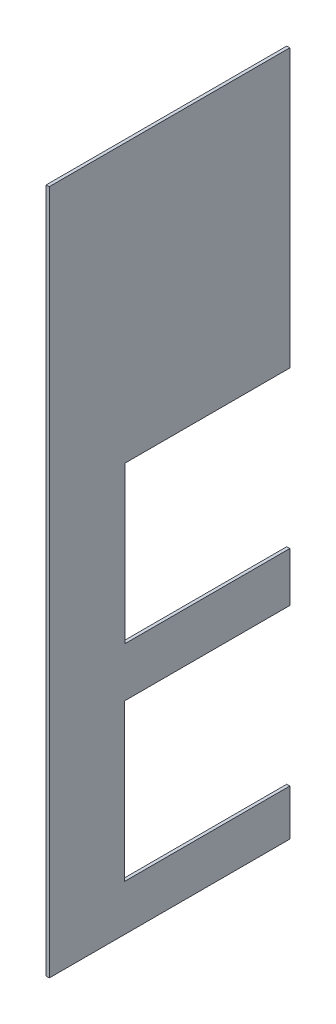
ISO-10303-21;
HEADER;
FILE_DESCRIPTION(('STEP AP214'),'2;1');
FILE_NAME('part.step','',(''),(''),'','','');
FILE_SCHEMA(('AUTOMOTIVE_DESIGN { 1 0 10303 214 1 1 1 1 }'));
ENDSEC;
DATA;
#1=APPLICATION_CONTEXT('core data for automotive mechanical design processes');
#2=APPLICATION_PROTOCOL_DEFINITION('international standard','automotive_design',2000,#1);
#3=PRODUCT_CONTEXT('',#1,'mechanical');
#4=PRODUCT('Part','Part','',(#3));
#5=PRODUCT_RELATED_PRODUCT_CATEGORY('part','',(#4));
#6=PRODUCT_DEFINITION_FORMATION('','',#4);
#7=PRODUCT_DEFINITION_CONTEXT('part definition',#1,'design');
#8=PRODUCT_DEFINITION('design','',#6,#7);
#9=PRODUCT_DEFINITION_SHAPE('','',#8);
#10=(LENGTH_UNIT() NAMED_UNIT(*) SI_UNIT(.MILLI.,.METRE.));
#11=(NAMED_UNIT(*) PLANE_ANGLE_UNIT() SI_UNIT($,.RADIAN.));
#12=(NAMED_UNIT(*) SI_UNIT($,.STERADIAN.) SOLID_ANGLE_UNIT());
#13=UNCERTAINTY_MEASURE_WITH_UNIT(LENGTH_MEASURE(1.E-05),#10,'distance_accuracy_value','');
#14=(GEOMETRIC_REPRESENTATION_CONTEXT(3) GLOBAL_UNCERTAINTY_ASSIGNED_CONTEXT((#13)) GLOBAL_UNIT_ASSIGNED_CONTEXT((#10,
#11,#12)) REPRESENTATION_CONTEXT('',''));
#15=CARTESIAN_POINT('',(0.,0.,0.));
#16=DIRECTION('',(0.,0.,1.));
#17=DIRECTION('',(1.,0.,0.));
#18=AXIS2_PLACEMENT_3D('',#15,#16,#17);
#19=CARTESIAN_POINT('',(1.,100.85,3.40000000000002));
#20=DIRECTION('',(0.,0.,-1.));
#21=DIRECTION('',(0.,1.,0.));
#22=AXIS2_PLACEMENT_3D('',#19,#20,#21);
#23=PLANE('',#22);
#24=DIRECTION('',(-1.,0.,0.));
#25=VECTOR('',#24,1.);
#26=CARTESIAN_POINT('',(1.,30.8070827212353,3.40000000000003));
#27=LINE('',#26,#25);
#28=CARTESIAN_POINT('',(1.,30.8070827212353,3.40000000000002));
#29=VERTEX_POINT('',#28);
#30=CARTESIAN_POINT('',(0.5,30.8070827212353,3.40000000000002));
#31=VERTEX_POINT('',#30);
#32=EDGE_CURVE('E170',#29,#31,#27,.T.);
#33=ORIENTED_EDGE('',*,*,#32,.F.);
#34=DIRECTION('',(0.,-1.,0.));
#35=VECTOR('',#34,1.);
#36=CARTESIAN_POINT('',(1.,100.85,3.40000000000002));
#37=LINE('',#36,#35);
#38=CARTESIAN_POINT('',(1.,22.832076617722,3.40000000000001));
#39=VERTEX_POINT('',#38);
#40=EDGE_CURVE('E187',#29,#39,#37,.T.);
#41=ORIENTED_EDGE('',*,*,#40,.T.);
#42=DIRECTION('',(1.,0.,0.));
#43=VECTOR('',#42,1.);
#44=CARTESIAN_POINT('',(1.,22.832076617722,3.40000000000003));
#45=LINE('',#44,#43);
#46=CARTESIAN_POINT('',(0.5,22.832076617722,3.40000000000001));
#47=VERTEX_POINT('',#46);
#48=EDGE_CURVE('E149',#47,#39,#45,.T.);
#49=ORIENTED_EDGE('',*,*,#48,.F.);
#50=DIRECTION('',(0.,-1.,0.));
#51=VECTOR('',#50,1.);
#52=CARTESIAN_POINT('',(0.5,100.85,3.40000000000002));
#53=LINE('',#52,#51);
#54=EDGE_CURVE('E199',#31,#47,#53,.T.);
#55=ORIENTED_EDGE('',*,*,#54,.F.);
#56=EDGE_LOOP('',(#33,#41,#49,#55));
#57=FACE_BOUND('',#56,.T.);
#58=ADVANCED_FACE('F32',(#57),#23,.T.);
#59=DIRECTION('',(-1.,0.,0.));
#60=VECTOR('',#59,1.);
#61=CARTESIAN_POINT('',(1.,-2.4179233822796,3.40000000000003));
#62=LINE('',#61,#60);
#63=CARTESIAN_POINT('',(1.,-2.4179233822796,3.40000000000003));
#64=VERTEX_POINT('',#63);
#65=CARTESIAN_POINT('',(0.5,-2.4179233822796,3.40000000000003));
#66=VERTEX_POINT('',#65);
#67=EDGE_CURVE('E167',#64,#66,#62,.T.);
#68=ORIENTED_EDGE('',*,*,#67,.F.);
#69=CARTESIAN_POINT('',(1.,-9.84999999999989,3.40000000000003));
#70=VERTEX_POINT('',#69);
#71=EDGE_CURVE('E183',#64,#70,#37,.T.);
#72=ORIENTED_EDGE('',*,*,#71,.T.);
#73=DIRECTION('',(-1.,0.,0.));
#74=VECTOR('',#73,1.);
#75=CARTESIAN_POINT('',(1.,-9.84999999999989,3.40000000000003));
#76=LINE('',#75,#74);
#77=CARTESIAN_POINT('',(0.5,-9.84999999999989,3.40000000000003));
#78=VERTEX_POINT('',#77);
#79=EDGE_CURVE('E200',#70,#78,#76,.T.);
#80=ORIENTED_EDGE('',*,*,#79,.T.);
#81=EDGE_CURVE('E196',#66,#78,#53,.T.);
#82=ORIENTED_EDGE('',*,*,#81,.F.);
#83=EDGE_LOOP('',(#68,#72,#80,#82));
#84=FACE_BOUND('',#83,.T.);
#85=ADVANCED_FACE('F230',(#84),#23,.T.);
#86=CARTESIAN_POINT('',(1.,-9.84999999999989,3.40000000000003));
#87=DIRECTION('',(0.,-1.,0.));
#88=DIRECTION('',(0.,0.,-1.));
#89=AXIS2_PLACEMENT_3D('',#86,#87,#88);
#90=PLANE('',#89);
#91=DIRECTION('',(0.,0.,1.));
#92=VECTOR('',#91,1.);
#93=CARTESIAN_POINT('',(0.5,-9.84999999999989,3.40000000000003));
#94=LINE('',#93,#92);
#95=CARTESIAN_POINT('',(0.5,-9.84999999999989,42.25));
#96=VERTEX_POINT('',#95);
#97=EDGE_CURVE('E172',#78,#96,#94,.T.);
#98=ORIENTED_EDGE('',*,*,#97,.F.);
#99=ORIENTED_EDGE('',*,*,#79,.F.);
#100=DIRECTION('',(0.,0.,1.));
#101=VECTOR('',#100,1.);
#102=CARTESIAN_POINT('',(1.,-9.84999999999989,3.40000000000003));
#103=LINE('',#102,#101);
#104=CARTESIAN_POINT('',(1.,-9.84999999999989,42.25));
#105=VERTEX_POINT('',#104);
#106=EDGE_CURVE('E173',#70,#105,#103,.T.);
#107=ORIENTED_EDGE('',*,*,#106,.T.);
#108=DIRECTION('',(-1.,0.,0.));
#109=VECTOR('',#108,1.);
#110=CARTESIAN_POINT('',(1.,-9.84999999999989,42.25));
#111=LINE('',#110,#109);
#112=EDGE_CURVE('E186',#105,#96,#111,.T.);
#113=ORIENTED_EDGE('',*,*,#112,.T.);
#114=EDGE_LOOP('',(#98,#99,#107,#113));
#115=FACE_BOUND('',#114,.T.);
#116=ADVANCED_FACE('F34',(#115),#90,.T.);
#117=DIRECTION('',(1.,0.,0.));
#118=VECTOR('',#117,1.);
#119=CARTESIAN_POINT('',(1.,56.0570827212335,3.40000000000002));
#120=LINE('',#119,#118);
#121=CARTESIAN_POINT('',(0.5,56.0570827212335,3.40000000000003));
#122=VERTEX_POINT('',#121);
#123=CARTESIAN_POINT('',(1.,56.0570827212335,3.40000000000003));
#124=VERTEX_POINT('',#123);
#125=EDGE_CURVE('E135',#122,#124,#120,.T.);
#126=ORIENTED_EDGE('',*,*,#125,.F.);
#127=CARTESIAN_POINT('',(0.5,100.85,3.40000000000002));
#128=VERTEX_POINT('',#127);
#129=EDGE_CURVE('E177',#128,#122,#53,.T.);
#130=ORIENTED_EDGE('',*,*,#129,.F.);
#131=DIRECTION('',(-1.,0.,0.));
#132=VECTOR('',#131,1.);
#133=CARTESIAN_POINT('',(1.,100.85,3.40000000000002));
#134=LINE('',#133,#132);
#135=CARTESIAN_POINT('',(1.,100.85,3.40000000000002));
#136=VERTEX_POINT('',#135);
#137=EDGE_CURVE('E203',#136,#128,#134,.T.);
#138=ORIENTED_EDGE('',*,*,#137,.F.);
#139=EDGE_CURVE('E184',#136,#124,#37,.T.);
#140=ORIENTED_EDGE('',*,*,#139,.T.);
#141=EDGE_LOOP('',(#126,#130,#138,#140));
#142=FACE_BOUND('',#141,.T.);
#143=ADVANCED_FACE('F243',(#142),#23,.T.);
#144=CARTESIAN_POINT('',(1.,100.85,42.25));
#145=DIRECTION('',(0.,1.,0.));
#146=DIRECTION('',(0.,0.,1.));
#147=AXIS2_PLACEMENT_3D('',#144,#145,#146);
#148=PLANE('',#147);
#149=DIRECTION('',(0.,0.,-1.));
#150=VECTOR('',#149,1.);
#151=CARTESIAN_POINT('',(0.5,100.85,42.25));
#152=LINE('',#151,#150);
#153=CARTESIAN_POINT('',(0.5,100.85,42.25));
#154=VERTEX_POINT('',#153);
#155=EDGE_CURVE('E193',#154,#128,#152,.T.);
#156=ORIENTED_EDGE('',*,*,#155,.F.);
#157=DIRECTION('',(-1.,0.,0.));
#158=VECTOR('',#157,1.);
#159=CARTESIAN_POINT('',(1.,100.85,42.25));
#160=LINE('',#159,#158);
#161=CARTESIAN_POINT('',(1.,100.85,42.25));
#162=VERTEX_POINT('',#161);
#163=EDGE_CURVE('E205',#162,#154,#160,.T.);
#164=ORIENTED_EDGE('',*,*,#163,.F.);
#165=DIRECTION('',(0.,0.,-1.));
#166=VECTOR('',#165,1.);
#167=CARTESIAN_POINT('',(1.,100.85,42.25));
#168=LINE('',#167,#166);
#169=EDGE_CURVE('E180',#162,#136,#168,.T.);
#170=ORIENTED_EDGE('',*,*,#169,.T.);
#171=ORIENTED_EDGE('',*,*,#137,.T.);
#172=EDGE_LOOP('',(#156,#164,#170,#171));
#173=FACE_BOUND('',#172,.T.);
#174=ADVANCED_FACE('F244',(#173),#148,.T.);
#175=CARTESIAN_POINT('',(1.,-9.84999999999989,42.25));
#176=DIRECTION('',(0.,0.,1.));
#177=DIRECTION('',(0.,-1.,0.));
#178=AXIS2_PLACEMENT_3D('',#175,#176,#177);
#179=PLANE('',#178);
#180=DIRECTION('',(0.,1.,0.));
#181=VECTOR('',#180,1.);
#182=CARTESIAN_POINT('',(0.5,-9.84999999999989,42.25));
#183=LINE('',#182,#181);
#184=EDGE_CURVE('E190',#96,#154,#183,.T.);
#185=ORIENTED_EDGE('',*,*,#184,.F.);
#186=ORIENTED_EDGE('',*,*,#112,.F.);
#187=DIRECTION('',(0.,1.,0.));
#188=VECTOR('',#187,1.);
#189=CARTESIAN_POINT('',(1.,-9.84999999999989,42.25));
#190=LINE('',#189,#188);
#191=EDGE_CURVE('E176',#105,#162,#190,.T.);
#192=ORIENTED_EDGE('',*,*,#191,.T.);
#193=ORIENTED_EDGE('',*,*,#163,.T.);
#194=EDGE_LOOP('',(#185,#186,#192,#193));
#195=FACE_BOUND('',#194,.T.);
#196=ADVANCED_FACE('F238',(#195),#179,.T.);
#197=CARTESIAN_POINT('',(1.,0.,0.));
#198=DIRECTION('',(-1.,0.,0.));
#199=DIRECTION('',(0.,0.,1.));
#200=AXIS2_PLACEMENT_3D('',#197,#198,#199);
#201=PLANE('',#200);
#202=ORIENTED_EDGE('',*,*,#40,.F.);
#203=DIRECTION('',(0.,4.37114345301024E-08,0.999999999999999));
#204=VECTOR('',#203,1.);
#205=CARTESIAN_POINT('',(1.,30.8070838842463,30.0065614418577));
#206=LINE('',#205,#204);
#207=CARTESIAN_POINT('',(1.,30.8070838842463,30.0065614418577));
#208=VERTEX_POINT('',#207);
#209=EDGE_CURVE('E129',#29,#208,#206,.T.);
#210=ORIENTED_EDGE('',*,*,#209,.T.);
#211=DIRECTION('',(0.,0.999999999999999,-4.37114218583463E-08));
#212=VECTOR('',#211,1.);
#213=CARTESIAN_POINT('',(1.,30.8070838842463,30.0065614418577));
#214=LINE('',#213,#212);
#215=CARTESIAN_POINT('',(1.,56.0570838842445,30.0065603381443));
#216=VERTEX_POINT('',#215);
#217=EDGE_CURVE('E124',#208,#216,#214,.T.);
#218=ORIENTED_EDGE('',*,*,#217,.T.);
#219=DIRECTION('',(0.,-4.37114381242467E-08,-0.999999999999999));
#220=VECTOR('',#219,1.);
#221=CARTESIAN_POINT('',(1.,56.0570838842445,30.0065603381443));
#222=LINE('',#221,#220);
#223=EDGE_CURVE('E132',#216,#124,#222,.T.);
#224=ORIENTED_EDGE('',*,*,#223,.T.);
#225=ORIENTED_EDGE('',*,*,#139,.F.);
#226=ORIENTED_EDGE('',*,*,#169,.F.);
#227=ORIENTED_EDGE('',*,*,#191,.F.);
#228=ORIENTED_EDGE('',*,*,#106,.F.);
#229=ORIENTED_EDGE('',*,*,#71,.F.);
#230=DIRECTION('',(0.,4.37114247184531E-08,0.999999999999999));
#231=VECTOR('',#230,1.);
#232=CARTESIAN_POINT('',(1.,-2.41792221489775,30.1065614418577));
#233=LINE('',#232,#231);
#234=CARTESIAN_POINT('',(1.,-2.41792221489775,30.1065614418577));
#235=VERTEX_POINT('',#234);
#236=EDGE_CURVE('E158',#64,#235,#233,.T.);
#237=ORIENTED_EDGE('',*,*,#236,.T.);
#238=DIRECTION('',(0.,0.999999999999999,-4.37114228201674E-08));
#239=VECTOR('',#238,1.);
#240=CARTESIAN_POINT('',(1.,-2.41792221489775,30.1065614418577));
#241=LINE('',#240,#239);
#242=CARTESIAN_POINT('',(1.,22.8320777851038,30.1065603381443));
#243=VERTEX_POINT('',#242);
#244=EDGE_CURVE('E151',#235,#243,#241,.T.);
#245=ORIENTED_EDGE('',*,*,#244,.T.);
#246=DIRECTION('',(0.,-4.37114246317689E-08,-0.999999999999999));
#247=VECTOR('',#246,1.);
#248=CARTESIAN_POINT('',(1.,22.8320777851038,30.1065603381443));
#249=LINE('',#248,#247);
#250=EDGE_CURVE('E154',#243,#39,#249,.T.);
#251=ORIENTED_EDGE('',*,*,#250,.T.);
#252=EDGE_LOOP('',(#202,#210,#218,#224,#225,#226,#227,#228,#229,#237,#245,#251));
#253=FACE_BOUND('',#252,.T.);
#254=ADVANCED_FACE('F141',(#253),#201,.F.);
#255=CARTESIAN_POINT('',(0.5,0.,0.));
#256=DIRECTION('',(-1.,0.,0.));
#257=DIRECTION('',(0.,0.,1.));
#258=AXIS2_PLACEMENT_3D('',#255,#256,#257);
#259=PLANE('',#258);
#260=DIRECTION('',(0.,4.37114345301024E-08,0.999999999999999));
#261=VECTOR('',#260,1.);
#262=CARTESIAN_POINT('',(0.5,30.8070825726164,-1.34662177293638E-06));
#263=LINE('',#262,#261);
#264=CARTESIAN_POINT('',(0.5,30.8070838842463,30.0065614418577));
#265=VERTEX_POINT('',#264);
#266=EDGE_CURVE('E11',#31,#265,#263,.T.);
#267=ORIENTED_EDGE('',*,*,#266,.F.);
#268=ORIENTED_EDGE('',*,*,#54,.T.);
#269=DIRECTION('',(0.,-4.37114246317689E-08,-0.999999999999999));
#270=VECTOR('',#269,1.);
#271=CARTESIAN_POINT('',(0.5,22.8320777851038,30.1065603381443));
#272=LINE('',#271,#270);
#273=CARTESIAN_POINT('',(0.5,22.8320777851038,30.1065603381443));
#274=VERTEX_POINT('',#273);
#275=EDGE_CURVE('E155',#274,#47,#272,.T.);
#276=ORIENTED_EDGE('',*,*,#275,.F.);
#277=DIRECTION('',(0.,0.999999999999999,-4.37114228201674E-08));
#278=VECTOR('',#277,1.);
#279=CARTESIAN_POINT('',(0.5,-2.41792221489775,30.1065614418577));
#280=LINE('',#279,#278);
#281=CARTESIAN_POINT('',(0.5,-2.41792221489775,30.1065614418577));
#282=VERTEX_POINT('',#281);
#283=EDGE_CURVE('E55',#282,#274,#280,.T.);
#284=ORIENTED_EDGE('',*,*,#283,.F.);
#285=DIRECTION('',(0.,4.37114247184531E-08,0.999999999999999));
#286=VECTOR('',#285,1.);
#287=CARTESIAN_POINT('',(0.5,-2.41792353089844,1.05690882395843E-07));
#288=LINE('',#287,#286);
#289=EDGE_CURVE('E40',#66,#282,#288,.T.);
#290=ORIENTED_EDGE('',*,*,#289,.F.);
#291=ORIENTED_EDGE('',*,*,#81,.T.);
#292=ORIENTED_EDGE('',*,*,#97,.T.);
#293=ORIENTED_EDGE('',*,*,#184,.T.);
#294=ORIENTED_EDGE('',*,*,#155,.T.);
#295=ORIENTED_EDGE('',*,*,#129,.T.);
#296=DIRECTION('',(0.,-4.37114381242467E-08,-0.999999999999999));
#297=VECTOR('',#296,1.);
#298=CARTESIAN_POINT('',(0.5,56.0570838842445,30.0065603381443));
#299=LINE('',#298,#297);
#300=CARTESIAN_POINT('',(0.5,56.0570838842445,30.0065603381443));
#301=VERTEX_POINT('',#300);
#302=EDGE_CURVE('E142',#301,#122,#299,.T.);
#303=ORIENTED_EDGE('',*,*,#302,.F.);
#304=DIRECTION('',(0.,0.999999999999999,-4.37114218583463E-08));
#305=VECTOR('',#304,1.);
#306=CARTESIAN_POINT('',(0.5,30.8070838842463,30.0065614418577));
#307=LINE('',#306,#305);
#308=EDGE_CURVE('E47',#265,#301,#307,.T.);
#309=ORIENTED_EDGE('',*,*,#308,.F.);
#310=EDGE_LOOP('',(#267,#268,#276,#284,#290,#291,#292,#293,#294,#295,#303,#309));
#311=FACE_BOUND('',#310,.T.);
#312=ADVANCED_FACE('F217',(#311),#259,.T.);
#313=CARTESIAN_POINT('',(1.,-2.41792221489775,30.1065614418577));
#314=DIRECTION('',(0.,4.37114228201674E-08,0.999999999999999));
#315=DIRECTION('',(0.,-0.999999999999999,4.37114228201674E-08));
#316=AXIS2_PLACEMENT_3D('',#313,#314,#315);
#317=PLANE('',#316);
#318=ORIENTED_EDGE('',*,*,#283,.T.);
#319=DIRECTION('',(-1.,0.,0.));
#320=VECTOR('',#319,1.);
#321=CARTESIAN_POINT('',(1.,22.8320777851038,30.1065603381443));
#322=LINE('',#321,#320);
#323=EDGE_CURVE('E161',#243,#274,#322,.T.);
#324=ORIENTED_EDGE('',*,*,#323,.F.);
#325=ORIENTED_EDGE('',*,*,#244,.F.);
#326=DIRECTION('',(-1.,0.,0.));
#327=VECTOR('',#326,1.);
#328=CARTESIAN_POINT('',(1.,-2.41792221489775,30.1065614418577));
#329=LINE('',#328,#327);
#330=EDGE_CURVE('E147',#235,#282,#329,.T.);
#331=ORIENTED_EDGE('',*,*,#330,.T.);
#332=EDGE_LOOP('',(#318,#324,#325,#331));
#333=FACE_BOUND('',#332,.T.);
#334=ADVANCED_FACE('F214',(#333),#317,.F.);
#335=CARTESIAN_POINT('',(1.,-2.41792221489775,30.1065614418577));
#336=DIRECTION('',(0.,-0.999999999999999,4.37114247184531E-08));
#337=DIRECTION('',(0.,-4.37114247184531E-08,-0.999999999999999));
#338=AXIS2_PLACEMENT_3D('',#335,#336,#337);
#339=PLANE('',#338);
#340=ORIENTED_EDGE('',*,*,#67,.T.);
#341=ORIENTED_EDGE('',*,*,#289,.T.);
#342=ORIENTED_EDGE('',*,*,#330,.F.);
#343=ORIENTED_EDGE('',*,*,#236,.F.);
#344=EDGE_LOOP('',(#340,#341,#342,#343));
#345=FACE_BOUND('',#344,.T.);
#346=ADVANCED_FACE('F209',(#345),#339,.F.);
#347=CARTESIAN_POINT('',(1.,22.8320777851038,30.1065603381443));
#348=DIRECTION('',(0.,0.999999999999999,-4.37114246317689E-08));
#349=DIRECTION('',(0.,4.37114246317689E-08,0.999999999999999));
#350=AXIS2_PLACEMENT_3D('',#347,#348,#349);
#351=PLANE('',#350);
#352=ORIENTED_EDGE('',*,*,#48,.T.);
#353=ORIENTED_EDGE('',*,*,#250,.F.);
#354=ORIENTED_EDGE('',*,*,#323,.T.);
#355=ORIENTED_EDGE('',*,*,#275,.T.);
#356=EDGE_LOOP('',(#352,#353,#354,#355));
#357=FACE_BOUND('',#356,.T.);
#358=ADVANCED_FACE('F222',(#357),#351,.F.);
#359=CARTESIAN_POINT('',(1.,30.8070838842463,30.0065614418577));
#360=DIRECTION('',(0.,4.37114218583463E-08,0.999999999999999));
#361=DIRECTION('',(0.,-0.999999999999999,4.37114218583463E-08));
#362=AXIS2_PLACEMENT_3D('',#359,#360,#361);
#363=PLANE('',#362);
#364=ORIENTED_EDGE('',*,*,#308,.T.);
#365=DIRECTION('',(-1.,0.,0.));
#366=VECTOR('',#365,1.);
#367=CARTESIAN_POINT('',(1.,56.0570838842445,30.0065603381443));
#368=LINE('',#367,#366);
#369=EDGE_CURVE('E120',#216,#301,#368,.T.);
#370=ORIENTED_EDGE('',*,*,#369,.F.);
#371=ORIENTED_EDGE('',*,*,#217,.F.);
#372=DIRECTION('',(-1.,0.,0.));
#373=VECTOR('',#372,1.);
#374=CARTESIAN_POINT('',(1.,30.8070838842463,30.0065614418577));
#375=LINE('',#374,#373);
#376=EDGE_CURVE('E128',#208,#265,#375,.T.);
#377=ORIENTED_EDGE('',*,*,#376,.T.);
#378=EDGE_LOOP('',(#364,#370,#371,#377));
#379=FACE_BOUND('',#378,.T.);
#380=ADVANCED_FACE('F122',(#379),#363,.F.);
#381=CARTESIAN_POINT('',(1.,30.8070838842463,30.0065614418577));
#382=DIRECTION('',(0.,-0.999999999999999,4.37114345301024E-08));
#383=DIRECTION('',(0.,-4.37114345301024E-08,-0.999999999999999));
#384=AXIS2_PLACEMENT_3D('',#381,#382,#383);
#385=PLANE('',#384);
#386=ORIENTED_EDGE('',*,*,#32,.T.);
#387=ORIENTED_EDGE('',*,*,#266,.T.);
#388=ORIENTED_EDGE('',*,*,#376,.F.);
#389=ORIENTED_EDGE('',*,*,#209,.F.);
#390=EDGE_LOOP('',(#386,#387,#388,#389));
#391=FACE_BOUND('',#390,.T.);
#392=ADVANCED_FACE('F269',(#391),#385,.F.);
#393=CARTESIAN_POINT('',(1.,56.0570838842445,30.0065603381443));
#394=DIRECTION('',(0.,0.999999999999999,-4.37114381242467E-08));
#395=DIRECTION('',(0.,4.37114381242467E-08,0.999999999999999));
#396=AXIS2_PLACEMENT_3D('',#393,#394,#395);
#397=PLANE('',#396);
#398=ORIENTED_EDGE('',*,*,#125,.T.);
#399=ORIENTED_EDGE('',*,*,#223,.F.);
#400=ORIENTED_EDGE('',*,*,#369,.T.);
#401=ORIENTED_EDGE('',*,*,#302,.T.);
#402=EDGE_LOOP('',(#398,#399,#400,#401));
#403=FACE_BOUND('',#402,.T.);
#404=ADVANCED_FACE('F133',(#403),#397,.F.);
#405=CLOSED_SHELL('',(#58,#85,#116,#143,#174,#196,#254,#312,#334,#346,#358,#380,#392,#404));
#406=MANIFOLD_SOLID_BREP('B2',#405);
#407=ADVANCED_BREP_SHAPE_REPRESENTATION('',(#18,#406),#14);
#408=SHAPE_DEFINITION_REPRESENTATION(#9,#407);
ENDSEC;
END-ISO-10303-21;
